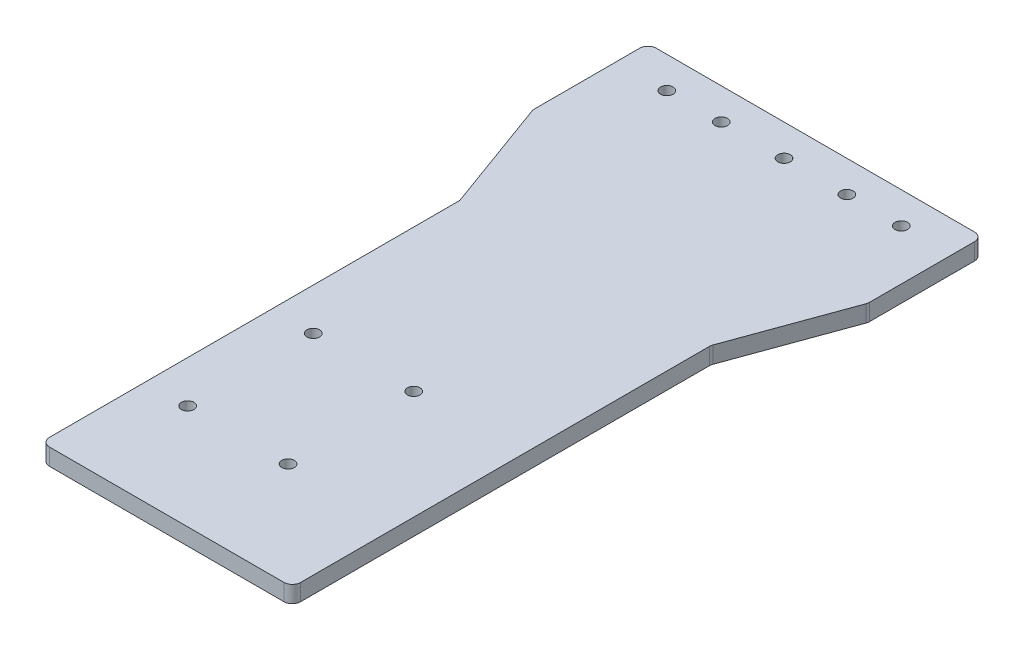
ISO-10303-21;
HEADER;
FILE_DESCRIPTION(('STEP AP214'),'2;1');
FILE_NAME('part.step','',(''),(''),'','','');
FILE_SCHEMA(('AUTOMOTIVE_DESIGN { 1 0 10303 214 1 1 1 1 }'));
ENDSEC;
DATA;
#1=APPLICATION_CONTEXT('core data for automotive mechanical design processes');
#2=APPLICATION_PROTOCOL_DEFINITION('international standard','automotive_design',2000,#1);
#3=PRODUCT_CONTEXT('',#1,'mechanical');
#4=PRODUCT('Part','Part','',(#3));
#5=PRODUCT_RELATED_PRODUCT_CATEGORY('part','',(#4));
#6=PRODUCT_DEFINITION_FORMATION('','',#4);
#7=PRODUCT_DEFINITION_CONTEXT('part definition',#1,'design');
#8=PRODUCT_DEFINITION('design','',#6,#7);
#9=PRODUCT_DEFINITION_SHAPE('','',#8);
#10=(LENGTH_UNIT() NAMED_UNIT(*) SI_UNIT(.MILLI.,.METRE.));
#11=(NAMED_UNIT(*) PLANE_ANGLE_UNIT() SI_UNIT($,.RADIAN.));
#12=(NAMED_UNIT(*) SI_UNIT($,.STERADIAN.) SOLID_ANGLE_UNIT());
#13=UNCERTAINTY_MEASURE_WITH_UNIT(LENGTH_MEASURE(1.E-05),#10,'distance_accuracy_value','');
#14=(GEOMETRIC_REPRESENTATION_CONTEXT(3) GLOBAL_UNCERTAINTY_ASSIGNED_CONTEXT((#13)) GLOBAL_UNIT_ASSIGNED_CONTEXT((#10,
#11,#12)) REPRESENTATION_CONTEXT('',''));
#15=CARTESIAN_POINT('',(0.,0.,0.));
#16=DIRECTION('',(0.,0.,1.));
#17=DIRECTION('',(1.,0.,0.));
#18=AXIS2_PLACEMENT_3D('',#15,#16,#17);
#19=CARTESIAN_POINT('',(67.9999999999997,4.,-127.827428155963));
#20=DIRECTION('',(0.,-1.,0.));
#21=DIRECTION('',(0.,0.,-1.));
#22=AXIS2_PLACEMENT_3D('',#19,#20,#21);
#23=CYLINDRICAL_SURFACE('',#22,2.);
#24=CARTESIAN_POINT('',(67.9999999999997,0.,-127.827428155963));
#25=DIRECTION('',(0.,1.,0.));
#26=DIRECTION('',(0.,0.,1.));
#27=AXIS2_PLACEMENT_3D('',#24,#25,#26);
#28=CIRCLE('',#27,2.);
#29=CARTESIAN_POINT('',(69.8793852415715,0.,-127.143387869312));
#30=VERTEX_POINT('',#29);
#31=CARTESIAN_POINT('',(69.9999999999997,0.,-127.827428155963));
#32=VERTEX_POINT('',#31);
#33=EDGE_CURVE('E180',#30,#32,#28,.T.);
#34=ORIENTED_EDGE('',*,*,#33,.T.);
#35=DIRECTION('',(0.,-1.,0.));
#36=VECTOR('',#35,1.);
#37=CARTESIAN_POINT('',(69.9999999999997,4.,-127.827428155963));
#38=LINE('',#37,#36);
#39=CARTESIAN_POINT('',(69.9999999999997,4.,-127.827428155963));
#40=VERTEX_POINT('',#39);
#41=EDGE_CURVE('E11',#40,#32,#38,.T.);
#42=ORIENTED_EDGE('',*,*,#41,.F.);
#43=CARTESIAN_POINT('',(67.9999999999997,4.,-127.827428155963));
#44=DIRECTION('',(0.,1.,0.));
#45=DIRECTION('',(0.,0.,1.));
#46=AXIS2_PLACEMENT_3D('',#43,#44,#45);
#47=CIRCLE('',#46,2.);
#48=CARTESIAN_POINT('',(69.8793852415715,4.,-127.143387869312));
#49=VERTEX_POINT('',#48);
#50=EDGE_CURVE('E211',#49,#40,#47,.T.);
#51=ORIENTED_EDGE('',*,*,#50,.F.);
#52=DIRECTION('',(0.,-1.,0.));
#53=VECTOR('',#52,1.);
#54=CARTESIAN_POINT('',(69.8793852415715,4.,-127.143387869312));
#55=LINE('',#54,#53);
#56=EDGE_CURVE('E176',#49,#30,#55,.T.);
#57=ORIENTED_EDGE('',*,*,#56,.T.);
#58=EDGE_LOOP('',(#34,#42,#51,#57));
#59=FACE_BOUND('',#58,.T.);
#60=ADVANCED_FACE('F36',(#59),#23,.T.);
#61=CARTESIAN_POINT('',(69.9999999999997,4.,-152.949548389093));
#62=DIRECTION('',(-1.,0.,0.));
#63=DIRECTION('',(0.,0.,1.));
#64=AXIS2_PLACEMENT_3D('',#61,#62,#63);
#65=PLANE('',#64);
#66=DIRECTION('',(0.,0.,-1.));
#67=VECTOR('',#66,1.);
#68=CARTESIAN_POINT('',(69.9999999999997,0.,-152.949548389093));
#69=LINE('',#68,#67);
#70=CARTESIAN_POINT('',(69.9999999999997,0.,-152.949548389093));
#71=VERTEX_POINT('',#70);
#72=EDGE_CURVE('E183',#32,#71,#69,.T.);
#73=ORIENTED_EDGE('',*,*,#72,.T.);
#74=DIRECTION('',(0.,-1.,0.));
#75=VECTOR('',#74,1.);
#76=CARTESIAN_POINT('',(69.9999999999997,4.,-152.949548389093));
#77=LINE('',#76,#75);
#78=CARTESIAN_POINT('',(69.9999999999997,4.,-152.949548389093));
#79=VERTEX_POINT('',#78);
#80=EDGE_CURVE('E44',#79,#71,#77,.T.);
#81=ORIENTED_EDGE('',*,*,#80,.F.);
#82=DIRECTION('',(0.,0.,-1.));
#83=VECTOR('',#82,1.);
#84=CARTESIAN_POINT('',(69.9999999999997,4.,-152.949548389093));
#85=LINE('',#84,#83);
#86=EDGE_CURVE('E119',#40,#79,#85,.T.);
#87=ORIENTED_EDGE('',*,*,#86,.F.);
#88=ORIENTED_EDGE('',*,*,#41,.T.);
#89=EDGE_LOOP('',(#73,#81,#87,#88));
#90=FACE_BOUND('',#89,.T.);
#91=ADVANCED_FACE('F310',(#90),#65,.F.);
#92=CARTESIAN_POINT('',(67.9999999999997,4.,-152.949548389093));
#93=DIRECTION('',(0.,-1.,0.));
#94=DIRECTION('',(0.,0.,-1.));
#95=AXIS2_PLACEMENT_3D('',#92,#93,#94);
#96=CYLINDRICAL_SURFACE('',#95,2.);
#97=CARTESIAN_POINT('',(67.9999999999997,0.,-152.949548389093));
#98=DIRECTION('',(0.,1.,0.));
#99=DIRECTION('',(0.,0.,1.));
#100=AXIS2_PLACEMENT_3D('',#97,#98,#99);
#101=CIRCLE('',#100,2.);
#102=CARTESIAN_POINT('',(67.9999999999997,0.,-154.949548389093));
#103=VERTEX_POINT('',#102);
#104=EDGE_CURVE('E186',#71,#103,#101,.T.);
#105=ORIENTED_EDGE('',*,*,#104,.T.);
#106=DIRECTION('',(0.,-1.,0.));
#107=VECTOR('',#106,1.);
#108=CARTESIAN_POINT('',(67.9999999999997,4.,-154.949548389093));
#109=LINE('',#108,#107);
#110=CARTESIAN_POINT('',(67.9999999999997,4.,-154.949548389093));
#111=VERTEX_POINT('',#110);
#112=EDGE_CURVE('E242',#111,#103,#109,.T.);
#113=ORIENTED_EDGE('',*,*,#112,.F.);
#114=CARTESIAN_POINT('',(67.9999999999997,4.,-152.949548389093));
#115=DIRECTION('',(0.,1.,0.));
#116=DIRECTION('',(0.,0.,1.));
#117=AXIS2_PLACEMENT_3D('',#114,#115,#116);
#118=CIRCLE('',#117,2.);
#119=EDGE_CURVE('E250',#79,#111,#118,.T.);
#120=ORIENTED_EDGE('',*,*,#119,.F.);
#121=ORIENTED_EDGE('',*,*,#80,.T.);
#122=EDGE_LOOP('',(#105,#113,#120,#121));
#123=FACE_BOUND('',#122,.T.);
#124=ADVANCED_FACE('F248',(#123),#96,.T.);
#125=CARTESIAN_POINT('',(-8.00000000000026,4.,-154.949548389093));
#126=DIRECTION('',(0.,0.,1.));
#127=DIRECTION('',(1.,0.,0.));
#128=AXIS2_PLACEMENT_3D('',#125,#126,#127);
#129=PLANE('',#128);
#130=DIRECTION('',(-1.,0.,0.));
#131=VECTOR('',#130,1.);
#132=CARTESIAN_POINT('',(-8.00000000000026,0.,-154.949548389093));
#133=LINE('',#132,#131);
#134=CARTESIAN_POINT('',(-8.00000000000027,0.,-154.949548389093));
#135=VERTEX_POINT('',#134);
#136=EDGE_CURVE('E188',#103,#135,#133,.T.);
#137=ORIENTED_EDGE('',*,*,#136,.T.);
#138=DIRECTION('',(0.,-1.,0.));
#139=VECTOR('',#138,1.);
#140=CARTESIAN_POINT('',(-8.00000000000027,4.,-154.949548389093));
#141=LINE('',#140,#139);
#142=CARTESIAN_POINT('',(-8.00000000000027,4.,-154.949548389093));
#143=VERTEX_POINT('',#142);
#144=EDGE_CURVE('E239',#143,#135,#141,.T.);
#145=ORIENTED_EDGE('',*,*,#144,.F.);
#146=DIRECTION('',(-1.,0.,0.));
#147=VECTOR('',#146,1.);
#148=CARTESIAN_POINT('',(-8.00000000000026,4.,-154.949548389093));
#149=LINE('',#148,#147);
#150=EDGE_CURVE('E268',#111,#143,#149,.T.);
#151=ORIENTED_EDGE('',*,*,#150,.F.);
#152=ORIENTED_EDGE('',*,*,#112,.T.);
#153=EDGE_LOOP('',(#137,#145,#151,#152));
#154=FACE_BOUND('',#153,.T.);
#155=ADVANCED_FACE('F259',(#154),#129,.F.);
#156=CARTESIAN_POINT('',(-8.00000000000027,4.,-152.949548389093));
#157=DIRECTION('',(0.,-1.,0.));
#158=DIRECTION('',(0.,0.,-1.));
#159=AXIS2_PLACEMENT_3D('',#156,#157,#158);
#160=CYLINDRICAL_SURFACE('',#159,2.);
#161=CARTESIAN_POINT('',(-8.00000000000027,0.,-152.949548389093));
#162=DIRECTION('',(0.,1.,0.));
#163=DIRECTION('',(0.,0.,-1.));
#164=AXIS2_PLACEMENT_3D('',#161,#162,#163);
#165=CIRCLE('',#164,2.);
#166=CARTESIAN_POINT('',(-10.0000000000003,0.,-152.949548389093));
#167=VERTEX_POINT('',#166);
#168=EDGE_CURVE('E190',#135,#167,#165,.T.);
#169=ORIENTED_EDGE('',*,*,#168,.T.);
#170=DIRECTION('',(0.,-1.,0.));
#171=VECTOR('',#170,1.);
#172=CARTESIAN_POINT('',(-10.0000000000003,4.,-152.949548389093));
#173=LINE('',#172,#171);
#174=CARTESIAN_POINT('',(-10.0000000000003,4.,-152.949548389093));
#175=VERTEX_POINT('',#174);
#176=EDGE_CURVE('E236',#175,#167,#173,.T.);
#177=ORIENTED_EDGE('',*,*,#176,.F.);
#178=CARTESIAN_POINT('',(-8.00000000000027,4.,-152.949548389093));
#179=DIRECTION('',(0.,1.,0.));
#180=DIRECTION('',(0.,0.,-1.));
#181=AXIS2_PLACEMENT_3D('',#178,#179,#180);
#182=CIRCLE('',#181,2.);
#183=EDGE_CURVE('E265',#143,#175,#182,.T.);
#184=ORIENTED_EDGE('',*,*,#183,.F.);
#185=ORIENTED_EDGE('',*,*,#144,.T.);
#186=EDGE_LOOP('',(#169,#177,#184,#185));
#187=FACE_BOUND('',#186,.T.);
#188=ADVANCED_FACE('F263',(#187),#160,.T.);
#189=CARTESIAN_POINT('',(-10.0000000000003,4.,-152.949548389093));
#190=DIRECTION('',(1.,0.,0.));
#191=DIRECTION('',(0.,0.,-1.));
#192=AXIS2_PLACEMENT_3D('',#189,#190,#191);
#193=PLANE('',#192);
#194=DIRECTION('',(0.,0.,1.));
#195=VECTOR('',#194,1.);
#196=CARTESIAN_POINT('',(-10.0000000000003,0.,-152.949548389093));
#197=LINE('',#196,#195);
#198=CARTESIAN_POINT('',(-10.0000000000003,0.,-127.827428155964));
#199=VERTEX_POINT('',#198);
#200=EDGE_CURVE('E192',#167,#199,#197,.T.);
#201=ORIENTED_EDGE('',*,*,#200,.T.);
#202=DIRECTION('',(0.,-1.,0.));
#203=VECTOR('',#202,1.);
#204=CARTESIAN_POINT('',(-10.0000000000003,4.,-127.827428155964));
#205=LINE('',#204,#203);
#206=CARTESIAN_POINT('',(-10.0000000000003,4.,-127.827428155964));
#207=VERTEX_POINT('',#206);
#208=EDGE_CURVE('E233',#207,#199,#205,.T.);
#209=ORIENTED_EDGE('',*,*,#208,.F.);
#210=DIRECTION('',(0.,0.,1.));
#211=VECTOR('',#210,1.);
#212=CARTESIAN_POINT('',(-10.0000000000003,4.,-152.949548389093));
#213=LINE('',#212,#211);
#214=EDGE_CURVE('E267',#175,#207,#213,.T.);
#215=ORIENTED_EDGE('',*,*,#214,.F.);
#216=ORIENTED_EDGE('',*,*,#176,.T.);
#217=EDGE_LOOP('',(#201,#209,#215,#216));
#218=FACE_BOUND('',#217,.T.);
#219=ADVANCED_FACE('F323',(#218),#193,.F.);
#220=CARTESIAN_POINT('',(-8.00000000000027,4.,-127.827428155964));
#221=DIRECTION('',(0.,-1.,0.));
#222=DIRECTION('',(0.,0.,-1.));
#223=AXIS2_PLACEMENT_3D('',#220,#221,#222);
#224=CYLINDRICAL_SURFACE('',#223,2.);
#225=CARTESIAN_POINT('',(-8.00000000000027,0.,-127.827428155964));
#226=DIRECTION('',(0.,1.,0.));
#227=DIRECTION('',(0.,0.,-1.));
#228=AXIS2_PLACEMENT_3D('',#225,#226,#227);
#229=CIRCLE('',#228,2.);
#230=CARTESIAN_POINT('',(-9.87938524157208,0.,-127.143387869312));
#231=VERTEX_POINT('',#230);
#232=EDGE_CURVE('E194',#199,#231,#229,.T.);
#233=ORIENTED_EDGE('',*,*,#232,.T.);
#234=DIRECTION('',(0.,-1.,0.));
#235=VECTOR('',#234,1.);
#236=CARTESIAN_POINT('',(-9.87938524157208,4.,-127.143387869312));
#237=LINE('',#236,#235);
#238=CARTESIAN_POINT('',(-9.87938524157208,4.,-127.143387869312));
#239=VERTEX_POINT('',#238);
#240=EDGE_CURVE('E230',#239,#231,#237,.T.);
#241=ORIENTED_EDGE('',*,*,#240,.F.);
#242=CARTESIAN_POINT('',(-8.00000000000027,4.,-127.827428155964));
#243=DIRECTION('',(0.,1.,0.));
#244=DIRECTION('',(0.,0.,-1.));
#245=AXIS2_PLACEMENT_3D('',#242,#243,#244);
#246=CIRCLE('',#245,2.);
#247=EDGE_CURVE('E270',#207,#239,#246,.T.);
#248=ORIENTED_EDGE('',*,*,#247,.F.);
#249=ORIENTED_EDGE('',*,*,#208,.T.);
#250=EDGE_LOOP('',(#233,#241,#248,#249));
#251=FACE_BOUND('',#250,.T.);
#252=ADVANCED_FACE('F326',(#251),#224,.T.);
#253=CARTESIAN_POINT('',(-0.120614758428187,4.,-100.331386325234));
#254=DIRECTION('',(0.939692620785908,0.,-0.34202014332567));
#255=DIRECTION('',(-0.34202014332567,0.,-0.939692620785908));
#256=AXIS2_PLACEMENT_3D('',#253,#254,#255);
#257=PLANE('',#256);
#258=DIRECTION('',(0.34202014332567,0.,0.939692620785908));
#259=VECTOR('',#258,1.);
#260=CARTESIAN_POINT('',(-0.120614758428187,0.,-100.331386325234));
#261=LINE('',#260,#259);
#262=CARTESIAN_POINT('',(-0.120614758428186,0.,-100.331386325234));
#263=VERTEX_POINT('',#262);
#264=EDGE_CURVE('E196',#231,#263,#261,.T.);
#265=ORIENTED_EDGE('',*,*,#264,.T.);
#266=DIRECTION('',(0.,-1.,0.));
#267=VECTOR('',#266,1.);
#268=CARTESIAN_POINT('',(-0.120614758428186,4.,-100.331386325234));
#269=LINE('',#268,#267);
#270=CARTESIAN_POINT('',(-0.120614758428186,4.,-100.331386325234));
#271=VERTEX_POINT('',#270);
#272=EDGE_CURVE('E227',#271,#263,#269,.T.);
#273=ORIENTED_EDGE('',*,*,#272,.F.);
#274=DIRECTION('',(0.34202014332567,0.,0.939692620785908));
#275=VECTOR('',#274,1.);
#276=CARTESIAN_POINT('',(-0.120614758428187,4.,-100.331386325234));
#277=LINE('',#276,#275);
#278=EDGE_CURVE('E276',#239,#271,#277,.T.);
#279=ORIENTED_EDGE('',*,*,#278,.F.);
#280=ORIENTED_EDGE('',*,*,#240,.T.);
#281=EDGE_LOOP('',(#265,#273,#279,#280));
#282=FACE_BOUND('',#281,.T.);
#283=ADVANCED_FACE('F330',(#282),#257,.F.);
#284=CARTESIAN_POINT('',(-2.,4.,-99.6473460385831));
#285=DIRECTION('',(0.,-1.,0.));
#286=DIRECTION('',(0.,0.,-1.));
#287=AXIS2_PLACEMENT_3D('',#284,#285,#286);
#288=CYLINDRICAL_SURFACE('',#287,2.);
#289=CARTESIAN_POINT('',(-2.,0.,-99.6473460385831));
#290=DIRECTION('',(0.,-1.,0.));
#291=DIRECTION('',(0.,0.,1.));
#292=AXIS2_PLACEMENT_3D('',#289,#290,#291);
#293=CIRCLE('',#292,2.);
#294=CARTESIAN_POINT('',(0.,0.,-99.6473460385831));
#295=VERTEX_POINT('',#294);
#296=EDGE_CURVE('E198',#263,#295,#293,.T.);
#297=ORIENTED_EDGE('',*,*,#296,.T.);
#298=DIRECTION('',(0.,-1.,0.));
#299=VECTOR('',#298,1.);
#300=CARTESIAN_POINT('',(0.,4.,-99.6473460385831));
#301=LINE('',#300,#299);
#302=CARTESIAN_POINT('',(0.,4.,-99.6473460385831));
#303=VERTEX_POINT('',#302);
#304=EDGE_CURVE('E224',#303,#295,#301,.T.);
#305=ORIENTED_EDGE('',*,*,#304,.F.);
#306=CARTESIAN_POINT('',(-2.,4.,-99.6473460385831));
#307=DIRECTION('',(0.,-1.,0.));
#308=DIRECTION('',(0.,0.,1.));
#309=AXIS2_PLACEMENT_3D('',#306,#307,#308);
#310=CIRCLE('',#309,2.);
#311=EDGE_CURVE('E278',#271,#303,#310,.T.);
#312=ORIENTED_EDGE('',*,*,#311,.F.);
#313=ORIENTED_EDGE('',*,*,#272,.T.);
#314=EDGE_LOOP('',(#297,#305,#312,#313));
#315=FACE_BOUND('',#314,.T.);
#316=ADVANCED_FACE('F334',(#315),#288,.F.);
#317=CARTESIAN_POINT('',(0.,4.,-2.00000000000001));
#318=DIRECTION('',(1.,0.,0.));
#319=DIRECTION('',(0.,0.,-1.));
#320=AXIS2_PLACEMENT_3D('',#317,#318,#319);
#321=PLANE('',#320);
#322=DIRECTION('',(0.,0.,1.));
#323=VECTOR('',#322,1.);
#324=CARTESIAN_POINT('',(0.,0.,-2.00000000000001));
#325=LINE('',#324,#323);
#326=CARTESIAN_POINT('',(0.,0.,-2.00000000000001));
#327=VERTEX_POINT('',#326);
#328=EDGE_CURVE('E200',#295,#327,#325,.T.);
#329=ORIENTED_EDGE('',*,*,#328,.T.);
#330=DIRECTION('',(0.,-1.,0.));
#331=VECTOR('',#330,1.);
#332=CARTESIAN_POINT('',(0.,4.,-2.00000000000001));
#333=LINE('',#332,#331);
#334=CARTESIAN_POINT('',(0.,4.,-2.00000000000001));
#335=VERTEX_POINT('',#334);
#336=EDGE_CURVE('E221',#335,#327,#333,.T.);
#337=ORIENTED_EDGE('',*,*,#336,.F.);
#338=DIRECTION('',(0.,0.,1.));
#339=VECTOR('',#338,1.);
#340=CARTESIAN_POINT('',(0.,4.,-2.00000000000001));
#341=LINE('',#340,#339);
#342=EDGE_CURVE('E280',#303,#335,#341,.T.);
#343=ORIENTED_EDGE('',*,*,#342,.F.);
#344=ORIENTED_EDGE('',*,*,#304,.T.);
#345=EDGE_LOOP('',(#329,#337,#343,#344));
#346=FACE_BOUND('',#345,.T.);
#347=ADVANCED_FACE('F338',(#346),#321,.F.);
#348=CARTESIAN_POINT('',(2.,4.,-2.));
#349=DIRECTION('',(0.,-1.,0.));
#350=DIRECTION('',(0.,0.,-1.));
#351=AXIS2_PLACEMENT_3D('',#348,#349,#350);
#352=CYLINDRICAL_SURFACE('',#351,2.);
#353=CARTESIAN_POINT('',(2.,0.,-2.));
#354=DIRECTION('',(0.,1.,0.));
#355=DIRECTION('',(0.,0.,-1.));
#356=AXIS2_PLACEMENT_3D('',#353,#354,#355);
#357=CIRCLE('',#356,2.);
#358=CARTESIAN_POINT('',(2.00000000000001,0.,0.));
#359=VERTEX_POINT('',#358);
#360=EDGE_CURVE('E202',#327,#359,#357,.T.);
#361=ORIENTED_EDGE('',*,*,#360,.T.);
#362=DIRECTION('',(0.,-1.,0.));
#363=VECTOR('',#362,1.);
#364=CARTESIAN_POINT('',(2.00000000000001,4.,0.));
#365=LINE('',#364,#363);
#366=CARTESIAN_POINT('',(2.00000000000001,4.,0.));
#367=VERTEX_POINT('',#366);
#368=EDGE_CURVE('E218',#367,#359,#365,.T.);
#369=ORIENTED_EDGE('',*,*,#368,.F.);
#370=CARTESIAN_POINT('',(2.,4.,-2.));
#371=DIRECTION('',(0.,1.,0.));
#372=DIRECTION('',(0.,0.,-1.));
#373=AXIS2_PLACEMENT_3D('',#370,#371,#372);
#374=CIRCLE('',#373,2.);
#375=EDGE_CURVE('E282',#335,#367,#374,.T.);
#376=ORIENTED_EDGE('',*,*,#375,.F.);
#377=ORIENTED_EDGE('',*,*,#336,.T.);
#378=EDGE_LOOP('',(#361,#369,#376,#377));
#379=FACE_BOUND('',#378,.T.);
#380=ADVANCED_FACE('F342',(#379),#352,.T.);
#381=CARTESIAN_POINT('',(2.00000000000001,4.,0.));
#382=DIRECTION('',(0.,0.,-1.));
#383=DIRECTION('',(-1.,0.,0.));
#384=AXIS2_PLACEMENT_3D('',#381,#382,#383);
#385=PLANE('',#384);
#386=DIRECTION('',(1.,0.,0.));
#387=VECTOR('',#386,1.);
#388=CARTESIAN_POINT('',(2.00000000000001,0.,0.));
#389=LINE('',#388,#387);
#390=CARTESIAN_POINT('',(58.,0.,0.));
#391=VERTEX_POINT('',#390);
#392=EDGE_CURVE('E204',#359,#391,#389,.T.);
#393=ORIENTED_EDGE('',*,*,#392,.T.);
#394=DIRECTION('',(0.,-1.,0.));
#395=VECTOR('',#394,1.);
#396=CARTESIAN_POINT('',(58.,4.,0.));
#397=LINE('',#396,#395);
#398=CARTESIAN_POINT('',(58.,4.,0.));
#399=VERTEX_POINT('',#398);
#400=EDGE_CURVE('E215',#399,#391,#397,.T.);
#401=ORIENTED_EDGE('',*,*,#400,.F.);
#402=DIRECTION('',(1.,0.,0.));
#403=VECTOR('',#402,1.);
#404=CARTESIAN_POINT('',(2.00000000000001,4.,0.));
#405=LINE('',#404,#403);
#406=EDGE_CURVE('E284',#367,#399,#405,.T.);
#407=ORIENTED_EDGE('',*,*,#406,.F.);
#408=ORIENTED_EDGE('',*,*,#368,.T.);
#409=EDGE_LOOP('',(#393,#401,#407,#408));
#410=FACE_BOUND('',#409,.T.);
#411=ADVANCED_FACE('F290',(#410),#385,.F.);
#412=CARTESIAN_POINT('',(58.,4.,-2.));
#413=DIRECTION('',(0.,-1.,0.));
#414=DIRECTION('',(0.,0.,-1.));
#415=AXIS2_PLACEMENT_3D('',#412,#413,#414);
#416=CYLINDRICAL_SURFACE('',#415,2.);
#417=CARTESIAN_POINT('',(58.,0.,-2.));
#418=DIRECTION('',(0.,1.,0.));
#419=DIRECTION('',(0.,0.,1.));
#420=AXIS2_PLACEMENT_3D('',#417,#418,#419);
#421=CIRCLE('',#420,2.);
#422=CARTESIAN_POINT('',(60.,0.,-2.00000000000001));
#423=VERTEX_POINT('',#422);
#424=EDGE_CURVE('E206',#391,#423,#421,.T.);
#425=ORIENTED_EDGE('',*,*,#424,.T.);
#426=DIRECTION('',(0.,-1.,0.));
#427=VECTOR('',#426,1.);
#428=CARTESIAN_POINT('',(60.,4.,-2.00000000000001));
#429=LINE('',#428,#427);
#430=CARTESIAN_POINT('',(60.,4.,-2.00000000000001));
#431=VERTEX_POINT('',#430);
#432=EDGE_CURVE('E171',#431,#423,#429,.T.);
#433=ORIENTED_EDGE('',*,*,#432,.F.);
#434=CARTESIAN_POINT('',(58.,4.,-2.));
#435=DIRECTION('',(0.,1.,0.));
#436=DIRECTION('',(0.,0.,1.));
#437=AXIS2_PLACEMENT_3D('',#434,#435,#436);
#438=CIRCLE('',#437,2.);
#439=EDGE_CURVE('E162',#399,#431,#438,.T.);
#440=ORIENTED_EDGE('',*,*,#439,.F.);
#441=ORIENTED_EDGE('',*,*,#400,.T.);
#442=EDGE_LOOP('',(#425,#433,#440,#441));
#443=FACE_BOUND('',#442,.T.);
#444=ADVANCED_FACE('F294',(#443),#416,.T.);
#445=CARTESIAN_POINT('',(60.,4.,-2.00000000000001));
#446=DIRECTION('',(-1.,0.,0.));
#447=DIRECTION('',(0.,0.,1.));
#448=AXIS2_PLACEMENT_3D('',#445,#446,#447);
#449=PLANE('',#448);
#450=DIRECTION('',(0.,0.,-1.));
#451=VECTOR('',#450,1.);
#452=CARTESIAN_POINT('',(60.,0.,-2.00000000000001));
#453=LINE('',#452,#451);
#454=CARTESIAN_POINT('',(60.,0.,-99.6473460385831));
#455=VERTEX_POINT('',#454);
#456=EDGE_CURVE('E170',#423,#455,#453,.T.);
#457=ORIENTED_EDGE('',*,*,#456,.T.);
#458=DIRECTION('',(0.,-1.,0.));
#459=VECTOR('',#458,1.);
#460=CARTESIAN_POINT('',(60.,4.,-99.6473460385831));
#461=LINE('',#460,#459);
#462=CARTESIAN_POINT('',(60.,4.,-99.6473460385831));
#463=VERTEX_POINT('',#462);
#464=EDGE_CURVE('E167',#463,#455,#461,.T.);
#465=ORIENTED_EDGE('',*,*,#464,.F.);
#466=DIRECTION('',(0.,0.,-1.));
#467=VECTOR('',#466,1.);
#468=CARTESIAN_POINT('',(60.,4.,-2.00000000000001));
#469=LINE('',#468,#467);
#470=EDGE_CURVE('E156',#431,#463,#469,.T.);
#471=ORIENTED_EDGE('',*,*,#470,.F.);
#472=ORIENTED_EDGE('',*,*,#432,.T.);
#473=EDGE_LOOP('',(#457,#465,#471,#472));
#474=FACE_BOUND('',#473,.T.);
#475=ADVANCED_FACE('F168',(#474),#449,.F.);
#476=CARTESIAN_POINT('',(62.,4.,-99.6473460385831));
#477=DIRECTION('',(0.,-1.,0.));
#478=DIRECTION('',(0.,0.,-1.));
#479=AXIS2_PLACEMENT_3D('',#476,#477,#478);
#480=CYLINDRICAL_SURFACE('',#479,2.);
#481=CARTESIAN_POINT('',(62.,0.,-99.6473460385831));
#482=DIRECTION('',(0.,-1.,0.));
#483=DIRECTION('',(0.,0.,1.));
#484=AXIS2_PLACEMENT_3D('',#481,#482,#483);
#485=CIRCLE('',#484,2.);
#486=CARTESIAN_POINT('',(60.1206147584282,0.,-100.331386325234));
#487=VERTEX_POINT('',#486);
#488=EDGE_CURVE('E105',#455,#487,#485,.T.);
#489=ORIENTED_EDGE('',*,*,#488,.T.);
#490=DIRECTION('',(0.,-1.,0.));
#491=VECTOR('',#490,1.);
#492=CARTESIAN_POINT('',(60.1206147584282,4.,-100.331386325234));
#493=LINE('',#492,#491);
#494=CARTESIAN_POINT('',(60.1206147584282,4.,-100.331386325234));
#495=VERTEX_POINT('',#494);
#496=EDGE_CURVE('E172',#495,#487,#493,.T.);
#497=ORIENTED_EDGE('',*,*,#496,.F.);
#498=CARTESIAN_POINT('',(62.,4.,-99.6473460385831));
#499=DIRECTION('',(0.,-1.,0.));
#500=DIRECTION('',(0.,0.,1.));
#501=AXIS2_PLACEMENT_3D('',#498,#499,#500);
#502=CIRCLE('',#501,2.);
#503=EDGE_CURVE('E160',#463,#495,#502,.T.);
#504=ORIENTED_EDGE('',*,*,#503,.F.);
#505=ORIENTED_EDGE('',*,*,#464,.T.);
#506=EDGE_LOOP('',(#489,#497,#504,#505));
#507=FACE_BOUND('',#506,.T.);
#508=ADVANCED_FACE('F174',(#507),#480,.F.);
#509=CARTESIAN_POINT('',(69.8793852415715,4.,-127.143387869312));
#510=DIRECTION('',(-0.939692620785911,0.,-0.342020143325662));
#511=DIRECTION('',(-0.342020143325662,0.,0.939692620785911));
#512=AXIS2_PLACEMENT_3D('',#509,#510,#511);
#513=PLANE('',#512);
#514=DIRECTION('',(0.342020143325662,0.,-0.939692620785911));
#515=VECTOR('',#514,1.);
#516=CARTESIAN_POINT('',(69.8793852415715,0.,-127.143387869312));
#517=LINE('',#516,#515);
#518=EDGE_CURVE('E111',#487,#30,#517,.T.);
#519=ORIENTED_EDGE('',*,*,#518,.T.);
#520=ORIENTED_EDGE('',*,*,#56,.F.);
#521=DIRECTION('',(0.342020143325662,0.,-0.939692620785911));
#522=VECTOR('',#521,1.);
#523=CARTESIAN_POINT('',(69.8793852415715,4.,-127.143387869312));
#524=LINE('',#523,#522);
#525=EDGE_CURVE('E52',#495,#49,#524,.T.);
#526=ORIENTED_EDGE('',*,*,#525,.F.);
#527=ORIENTED_EDGE('',*,*,#496,.T.);
#528=EDGE_LOOP('',(#519,#520,#526,#527));
#529=FACE_BOUND('',#528,.T.);
#530=ADVANCED_FACE('F298',(#529),#513,.F.);
#531=CARTESIAN_POINT('',(67.9999999999997,4.,-127.827428155963));
#532=DIRECTION('',(0.,1.,0.));
#533=DIRECTION('',(0.,0.,1.));
#534=AXIS2_PLACEMENT_3D('',#531,#532,#533);
#535=PLANE('',#534);
#536=CARTESIAN_POINT('',(29.9999999999997,4.,-147.449548389093));
#537=DIRECTION('',(0.,1.,0.));
#538=DIRECTION('',(0.,0.,1.));
#539=AXIS2_PLACEMENT_3D('',#536,#537,#538);
#540=CIRCLE('',#539,1.5);
#541=CARTESIAN_POINT('',(29.9999999999997,4.,-145.949548389093));
#542=VERTEX_POINT('',#541);
#543=EDGE_CURVE('E478',#542,#542,#540,.T.);
#544=ORIENTED_EDGE('',*,*,#543,.F.);
#545=EDGE_LOOP('',(#544));
#546=FACE_BOUND('',#545,.T.);
#547=CARTESIAN_POINT('',(57.9999999999997,4.,-147.449548389093));
#548=DIRECTION('',(0.,1.,0.));
#549=DIRECTION('',(0.,0.,-1.));
#550=AXIS2_PLACEMENT_3D('',#547,#548,#549);
#551=CIRCLE('',#550,1.5);
#552=CARTESIAN_POINT('',(57.9999999999997,4.,-148.949548389093));
#553=VERTEX_POINT('',#552);
#554=EDGE_CURVE('E480',#553,#553,#551,.T.);
#555=ORIENTED_EDGE('',*,*,#554,.F.);
#556=EDGE_LOOP('',(#555));
#557=FACE_BOUND('',#556,.T.);
#558=CARTESIAN_POINT('',(44.9999999999998,4.,-147.449548389093));
#559=DIRECTION('',(0.,1.,0.));
#560=DIRECTION('',(0.,0.,-1.));
#561=AXIS2_PLACEMENT_3D('',#558,#559,#560);
#562=CIRCLE('',#561,1.5);
#563=CARTESIAN_POINT('',(44.9999999999998,4.,-148.949548389093));
#564=VERTEX_POINT('',#563);
#565=EDGE_CURVE('E494',#564,#564,#562,.T.);
#566=ORIENTED_EDGE('',*,*,#565,.F.);
#567=EDGE_LOOP('',(#566));
#568=FACE_BOUND('',#567,.T.);
#569=CARTESIAN_POINT('',(14.9999999999997,4.,-147.449548389093));
#570=DIRECTION('',(0.,1.,0.));
#571=DIRECTION('',(0.,0.,1.));
#572=AXIS2_PLACEMENT_3D('',#569,#570,#571);
#573=CIRCLE('',#572,1.5);
#574=CARTESIAN_POINT('',(14.9999999999997,4.,-145.949548389093));
#575=VERTEX_POINT('',#574);
#576=EDGE_CURVE('E488',#575,#575,#573,.T.);
#577=ORIENTED_EDGE('',*,*,#576,.F.);
#578=EDGE_LOOP('',(#577));
#579=FACE_BOUND('',#578,.T.);
#580=CARTESIAN_POINT('',(1.99999999999974,4.,-147.449548389093));
#581=DIRECTION('',(0.,1.,0.));
#582=DIRECTION('',(0.,0.,1.));
#583=AXIS2_PLACEMENT_3D('',#580,#581,#582);
#584=CIRCLE('',#583,1.5);
#585=CARTESIAN_POINT('',(1.99999999999974,4.,-145.949548389093));
#586=VERTEX_POINT('',#585);
#587=EDGE_CURVE('E487',#586,#586,#584,.T.);
#588=ORIENTED_EDGE('',*,*,#587,.F.);
#589=EDGE_LOOP('',(#588));
#590=FACE_BOUND('',#589,.T.);
#591=CARTESIAN_POINT('',(34.,4.,-25.));
#592=DIRECTION('',(0.,1.,0.));
#593=DIRECTION('',(0.,0.,1.));
#594=AXIS2_PLACEMENT_3D('',#591,#592,#593);
#595=CIRCLE('',#594,1.5);
#596=CARTESIAN_POINT('',(34.,4.,-23.5));
#597=VERTEX_POINT('',#596);
#598=EDGE_CURVE('E508',#597,#597,#595,.T.);
#599=ORIENTED_EDGE('',*,*,#598,.F.);
#600=EDGE_LOOP('',(#599));
#601=FACE_BOUND('',#600,.T.);
#602=CARTESIAN_POINT('',(33.9999999999999,4.,-55.));
#603=DIRECTION('',(0.,1.,0.));
#604=DIRECTION('',(0.,0.,1.));
#605=AXIS2_PLACEMENT_3D('',#602,#603,#604);
#606=CIRCLE('',#605,1.5);
#607=CARTESIAN_POINT('',(33.9999999999999,4.,-53.5));
#608=VERTEX_POINT('',#607);
#609=EDGE_CURVE('E514',#608,#608,#606,.T.);
#610=ORIENTED_EDGE('',*,*,#609,.F.);
#611=EDGE_LOOP('',(#610));
#612=FACE_BOUND('',#611,.T.);
#613=CARTESIAN_POINT('',(9.9999999999999,4.,-55.));
#614=DIRECTION('',(0.,1.,0.));
#615=DIRECTION('',(0.,0.,1.));
#616=AXIS2_PLACEMENT_3D('',#613,#614,#615);
#617=CIRCLE('',#616,1.5);
#618=CARTESIAN_POINT('',(9.9999999999999,4.,-53.5));
#619=VERTEX_POINT('',#618);
#620=EDGE_CURVE('E501',#619,#619,#617,.T.);
#621=ORIENTED_EDGE('',*,*,#620,.F.);
#622=EDGE_LOOP('',(#621));
#623=FACE_BOUND('',#622,.T.);
#624=CARTESIAN_POINT('',(10.,4.,-25.));
#625=DIRECTION('',(0.,1.,0.));
#626=DIRECTION('',(0.,0.,1.));
#627=AXIS2_PLACEMENT_3D('',#624,#625,#626);
#628=CIRCLE('',#627,1.5);
#629=CARTESIAN_POINT('',(10.,4.,-23.5));
#630=VERTEX_POINT('',#629);
#631=EDGE_CURVE('E507',#630,#630,#628,.T.);
#632=ORIENTED_EDGE('',*,*,#631,.F.);
#633=EDGE_LOOP('',(#632));
#634=FACE_BOUND('',#633,.T.);
#635=ORIENTED_EDGE('',*,*,#50,.T.);
#636=ORIENTED_EDGE('',*,*,#86,.T.);
#637=ORIENTED_EDGE('',*,*,#119,.T.);
#638=ORIENTED_EDGE('',*,*,#150,.T.);
#639=ORIENTED_EDGE('',*,*,#183,.T.);
#640=ORIENTED_EDGE('',*,*,#214,.T.);
#641=ORIENTED_EDGE('',*,*,#247,.T.);
#642=ORIENTED_EDGE('',*,*,#278,.T.);
#643=ORIENTED_EDGE('',*,*,#311,.T.);
#644=ORIENTED_EDGE('',*,*,#342,.T.);
#645=ORIENTED_EDGE('',*,*,#375,.T.);
#646=ORIENTED_EDGE('',*,*,#406,.T.);
#647=ORIENTED_EDGE('',*,*,#439,.T.);
#648=ORIENTED_EDGE('',*,*,#470,.T.);
#649=ORIENTED_EDGE('',*,*,#503,.T.);
#650=ORIENTED_EDGE('',*,*,#525,.T.);
#651=EDGE_LOOP('',(#635,#636,#637,#638,#639,#640,#641,#642,#643,#644,#645,#646,#647,#648,#649,#650));
#652=FACE_BOUND('',#651,.T.);
#653=ADVANCED_FACE('F158',(#546,#557,#568,#579,#590,#601,#612,#623,#634,#652),#535,.T.);
#654=CARTESIAN_POINT('',(67.9999999999997,0.,-127.827428155963));
#655=DIRECTION('',(0.,1.,0.));
#656=DIRECTION('',(0.,0.,1.));
#657=AXIS2_PLACEMENT_3D('',#654,#655,#656);
#658=PLANE('',#657);
#659=CARTESIAN_POINT('',(29.9999999999997,0.,-147.449548389093));
#660=DIRECTION('',(0.,1.,0.));
#661=DIRECTION('',(0.,0.,1.));
#662=AXIS2_PLACEMENT_3D('',#659,#660,#661);
#663=CIRCLE('',#662,1.5);
#664=CARTESIAN_POINT('',(29.9999999999997,0.,-145.949548389093));
#665=VERTEX_POINT('',#664);
#666=EDGE_CURVE('E475',#665,#665,#663,.T.);
#667=ORIENTED_EDGE('',*,*,#666,.T.);
#668=EDGE_LOOP('',(#667));
#669=FACE_BOUND('',#668,.T.);
#670=CARTESIAN_POINT('',(57.9999999999997,0.,-147.449548389093));
#671=DIRECTION('',(0.,1.,0.));
#672=DIRECTION('',(0.,0.,-1.));
#673=AXIS2_PLACEMENT_3D('',#670,#671,#672);
#674=CIRCLE('',#673,1.5);
#675=CARTESIAN_POINT('',(57.9999999999997,0.,-148.949548389093));
#676=VERTEX_POINT('',#675);
#677=EDGE_CURVE('E497',#676,#676,#674,.T.);
#678=ORIENTED_EDGE('',*,*,#677,.T.);
#679=EDGE_LOOP('',(#678));
#680=FACE_BOUND('',#679,.T.);
#681=CARTESIAN_POINT('',(44.9999999999998,0.,-147.449548389093));
#682=DIRECTION('',(0.,1.,0.));
#683=DIRECTION('',(0.,0.,-1.));
#684=AXIS2_PLACEMENT_3D('',#681,#682,#683);
#685=CIRCLE('',#684,1.5);
#686=CARTESIAN_POINT('',(44.9999999999998,0.,-148.949548389093));
#687=VERTEX_POINT('',#686);
#688=EDGE_CURVE('E491',#687,#687,#685,.T.);
#689=ORIENTED_EDGE('',*,*,#688,.T.);
#690=EDGE_LOOP('',(#689));
#691=FACE_BOUND('',#690,.T.);
#692=CARTESIAN_POINT('',(14.9999999999997,0.,-147.449548389093));
#693=DIRECTION('',(0.,1.,0.));
#694=DIRECTION('',(0.,0.,1.));
#695=AXIS2_PLACEMENT_3D('',#692,#693,#694);
#696=CIRCLE('',#695,1.5);
#697=CARTESIAN_POINT('',(14.9999999999997,0.,-145.949548389093));
#698=VERTEX_POINT('',#697);
#699=EDGE_CURVE('E484',#698,#698,#696,.T.);
#700=ORIENTED_EDGE('',*,*,#699,.T.);
#701=EDGE_LOOP('',(#700));
#702=FACE_BOUND('',#701,.T.);
#703=CARTESIAN_POINT('',(1.99999999999974,0.,-147.449548389093));
#704=DIRECTION('',(0.,1.,0.));
#705=DIRECTION('',(0.,0.,1.));
#706=AXIS2_PLACEMENT_3D('',#703,#704,#705);
#707=CIRCLE('',#706,1.5);
#708=CARTESIAN_POINT('',(1.99999999999974,0.,-145.949548389093));
#709=VERTEX_POINT('',#708);
#710=EDGE_CURVE('E498',#709,#709,#707,.T.);
#711=ORIENTED_EDGE('',*,*,#710,.T.);
#712=EDGE_LOOP('',(#711));
#713=FACE_BOUND('',#712,.T.);
#714=CARTESIAN_POINT('',(34.,0.,-25.));
#715=DIRECTION('',(0.,1.,0.));
#716=DIRECTION('',(0.,0.,1.));
#717=AXIS2_PLACEMENT_3D('',#714,#715,#716);
#718=CIRCLE('',#717,1.5);
#719=CARTESIAN_POINT('',(34.,0.,-23.5));
#720=VERTEX_POINT('',#719);
#721=EDGE_CURVE('E504',#720,#720,#718,.T.);
#722=ORIENTED_EDGE('',*,*,#721,.T.);
#723=EDGE_LOOP('',(#722));
#724=FACE_BOUND('',#723,.T.);
#725=CARTESIAN_POINT('',(33.9999999999999,0.,-55.));
#726=DIRECTION('',(0.,1.,0.));
#727=DIRECTION('',(0.,0.,1.));
#728=AXIS2_PLACEMENT_3D('',#725,#726,#727);
#729=CIRCLE('',#728,1.5);
#730=CARTESIAN_POINT('',(33.9999999999999,0.,-53.5));
#731=VERTEX_POINT('',#730);
#732=EDGE_CURVE('E511',#731,#731,#729,.T.);
#733=ORIENTED_EDGE('',*,*,#732,.T.);
#734=EDGE_LOOP('',(#733));
#735=FACE_BOUND('',#734,.T.);
#736=CARTESIAN_POINT('',(9.9999999999999,0.,-55.));
#737=DIRECTION('',(0.,1.,0.));
#738=DIRECTION('',(0.,0.,1.));
#739=AXIS2_PLACEMENT_3D('',#736,#737,#738);
#740=CIRCLE('',#739,1.5);
#741=CARTESIAN_POINT('',(9.9999999999999,0.,-53.5));
#742=VERTEX_POINT('',#741);
#743=EDGE_CURVE('E517',#742,#742,#740,.T.);
#744=ORIENTED_EDGE('',*,*,#743,.T.);
#745=EDGE_LOOP('',(#744));
#746=FACE_BOUND('',#745,.T.);
#747=CARTESIAN_POINT('',(10.,0.,-25.));
#748=DIRECTION('',(0.,1.,0.));
#749=DIRECTION('',(0.,0.,1.));
#750=AXIS2_PLACEMENT_3D('',#747,#748,#749);
#751=CIRCLE('',#750,1.5);
#752=CARTESIAN_POINT('',(10.,0.,-23.5));
#753=VERTEX_POINT('',#752);
#754=EDGE_CURVE('E184',#753,#753,#751,.T.);
#755=ORIENTED_EDGE('',*,*,#754,.T.);
#756=EDGE_LOOP('',(#755));
#757=FACE_BOUND('',#756,.T.);
#758=ORIENTED_EDGE('',*,*,#33,.F.);
#759=ORIENTED_EDGE('',*,*,#518,.F.);
#760=ORIENTED_EDGE('',*,*,#488,.F.);
#761=ORIENTED_EDGE('',*,*,#456,.F.);
#762=ORIENTED_EDGE('',*,*,#424,.F.);
#763=ORIENTED_EDGE('',*,*,#392,.F.);
#764=ORIENTED_EDGE('',*,*,#360,.F.);
#765=ORIENTED_EDGE('',*,*,#328,.F.);
#766=ORIENTED_EDGE('',*,*,#296,.F.);
#767=ORIENTED_EDGE('',*,*,#264,.F.);
#768=ORIENTED_EDGE('',*,*,#232,.F.);
#769=ORIENTED_EDGE('',*,*,#200,.F.);
#770=ORIENTED_EDGE('',*,*,#168,.F.);
#771=ORIENTED_EDGE('',*,*,#136,.F.);
#772=ORIENTED_EDGE('',*,*,#104,.F.);
#773=ORIENTED_EDGE('',*,*,#72,.F.);
#774=EDGE_LOOP('',(#758,#759,#760,#761,#762,#763,#764,#765,#766,#767,#768,#769,#770,#771,#772,#773));
#775=FACE_BOUND('',#774,.T.);
#776=ADVANCED_FACE('F254',(#669,#680,#691,#702,#713,#724,#735,#746,#757,#775),#658,.F.);
#777=CARTESIAN_POINT('',(10.,0.,-25.));
#778=DIRECTION('',(0.,1.,0.));
#779=DIRECTION('',(0.,0.,1.));
#780=AXIS2_PLACEMENT_3D('',#777,#778,#779);
#781=CYLINDRICAL_SURFACE('',#780,1.5);
#782=ORIENTED_EDGE('',*,*,#754,.F.);
#783=EDGE_LOOP('',(#782));
#784=FACE_BOUND('',#783,.T.);
#785=ORIENTED_EDGE('',*,*,#631,.T.);
#786=EDGE_LOOP('',(#785));
#787=FACE_BOUND('',#786,.T.);
#788=ADVANCED_FACE('F370',(#784,#787),#781,.F.);
#789=CARTESIAN_POINT('',(9.9999999999999,0.,-55.));
#790=DIRECTION('',(0.,1.,0.));
#791=DIRECTION('',(0.,0.,1.));
#792=AXIS2_PLACEMENT_3D('',#789,#790,#791);
#793=CYLINDRICAL_SURFACE('',#792,1.5);
#794=ORIENTED_EDGE('',*,*,#743,.F.);
#795=EDGE_LOOP('',(#794));
#796=FACE_BOUND('',#795,.T.);
#797=ORIENTED_EDGE('',*,*,#620,.T.);
#798=EDGE_LOOP('',(#797));
#799=FACE_BOUND('',#798,.T.);
#800=ADVANCED_FACE('F375',(#796,#799),#793,.F.);
#801=CARTESIAN_POINT('',(33.9999999999999,0.,-55.));
#802=DIRECTION('',(0.,1.,0.));
#803=DIRECTION('',(0.,0.,1.));
#804=AXIS2_PLACEMENT_3D('',#801,#802,#803);
#805=CYLINDRICAL_SURFACE('',#804,1.5);
#806=ORIENTED_EDGE('',*,*,#732,.F.);
#807=EDGE_LOOP('',(#806));
#808=FACE_BOUND('',#807,.T.);
#809=ORIENTED_EDGE('',*,*,#609,.T.);
#810=EDGE_LOOP('',(#809));
#811=FACE_BOUND('',#810,.T.);
#812=ADVANCED_FACE('F387',(#808,#811),#805,.F.);
#813=CARTESIAN_POINT('',(34.,0.,-25.));
#814=DIRECTION('',(0.,1.,0.));
#815=DIRECTION('',(0.,0.,1.));
#816=AXIS2_PLACEMENT_3D('',#813,#814,#815);
#817=CYLINDRICAL_SURFACE('',#816,1.5);
#818=ORIENTED_EDGE('',*,*,#721,.F.);
#819=EDGE_LOOP('',(#818));
#820=FACE_BOUND('',#819,.T.);
#821=ORIENTED_EDGE('',*,*,#598,.T.);
#822=EDGE_LOOP('',(#821));
#823=FACE_BOUND('',#822,.T.);
#824=ADVANCED_FACE('F397',(#820,#823),#817,.F.);
#825=CARTESIAN_POINT('',(1.99999999999974,0.,-147.449548389093));
#826=DIRECTION('',(0.,1.,0.));
#827=DIRECTION('',(0.,0.,1.));
#828=AXIS2_PLACEMENT_3D('',#825,#826,#827);
#829=CYLINDRICAL_SURFACE('',#828,1.5);
#830=ORIENTED_EDGE('',*,*,#710,.F.);
#831=EDGE_LOOP('',(#830));
#832=FACE_BOUND('',#831,.T.);
#833=ORIENTED_EDGE('',*,*,#587,.T.);
#834=EDGE_LOOP('',(#833));
#835=FACE_BOUND('',#834,.T.);
#836=ADVANCED_FACE('F407',(#832,#835),#829,.F.);
#837=CARTESIAN_POINT('',(14.9999999999997,0.,-147.449548389093));
#838=DIRECTION('',(0.,1.,0.));
#839=DIRECTION('',(0.,0.,1.));
#840=AXIS2_PLACEMENT_3D('',#837,#838,#839);
#841=CYLINDRICAL_SURFACE('',#840,1.5);
#842=ORIENTED_EDGE('',*,*,#699,.F.);
#843=EDGE_LOOP('',(#842));
#844=FACE_BOUND('',#843,.T.);
#845=ORIENTED_EDGE('',*,*,#576,.T.);
#846=EDGE_LOOP('',(#845));
#847=FACE_BOUND('',#846,.T.);
#848=ADVANCED_FACE('F428',(#844,#847),#841,.F.);
#849=CARTESIAN_POINT('',(44.9999999999998,0.,-147.449548389093));
#850=DIRECTION('',(0.,1.,0.));
#851=DIRECTION('',(0.,0.,1.));
#852=AXIS2_PLACEMENT_3D('',#849,#850,#851);
#853=CYLINDRICAL_SURFACE('',#852,1.5);
#854=ORIENTED_EDGE('',*,*,#688,.F.);
#855=EDGE_LOOP('',(#854));
#856=FACE_BOUND('',#855,.T.);
#857=ORIENTED_EDGE('',*,*,#565,.T.);
#858=EDGE_LOOP('',(#857));
#859=FACE_BOUND('',#858,.T.);
#860=ADVANCED_FACE('F438',(#856,#859),#853,.F.);
#861=CARTESIAN_POINT('',(57.9999999999997,0.,-147.449548389093));
#862=DIRECTION('',(0.,1.,0.));
#863=DIRECTION('',(0.,0.,1.));
#864=AXIS2_PLACEMENT_3D('',#861,#862,#863);
#865=CYLINDRICAL_SURFACE('',#864,1.5);
#866=ORIENTED_EDGE('',*,*,#677,.F.);
#867=EDGE_LOOP('',(#866));
#868=FACE_BOUND('',#867,.T.);
#869=ORIENTED_EDGE('',*,*,#554,.T.);
#870=EDGE_LOOP('',(#869));
#871=FACE_BOUND('',#870,.T.);
#872=ADVANCED_FACE('F448',(#868,#871),#865,.F.);
#873=CARTESIAN_POINT('',(29.9999999999997,0.,-147.449548389093));
#874=DIRECTION('',(0.,1.,0.));
#875=DIRECTION('',(0.,0.,1.));
#876=AXIS2_PLACEMENT_3D('',#873,#874,#875);
#877=CYLINDRICAL_SURFACE('',#876,1.5);
#878=ORIENTED_EDGE('',*,*,#666,.F.);
#879=EDGE_LOOP('',(#878));
#880=FACE_BOUND('',#879,.T.);
#881=ORIENTED_EDGE('',*,*,#543,.T.);
#882=EDGE_LOOP('',(#881));
#883=FACE_BOUND('',#882,.T.);
#884=ADVANCED_FACE('F458',(#880,#883),#877,.F.);
#885=CLOSED_SHELL('',(#60,#91,#124,#155,#188,#219,#252,#283,#316,#347,#380,#411,#444,#475,#508,
#530,#653,#776,#788,#800,#812,#824,#836,#848,#860,#872,#884));
#886=MANIFOLD_SOLID_BREP('B2',#885);
#887=ADVANCED_BREP_SHAPE_REPRESENTATION('',(#18,#886),#14);
#888=SHAPE_DEFINITION_REPRESENTATION(#9,#887);
ENDSEC;
END-ISO-10303-21;
